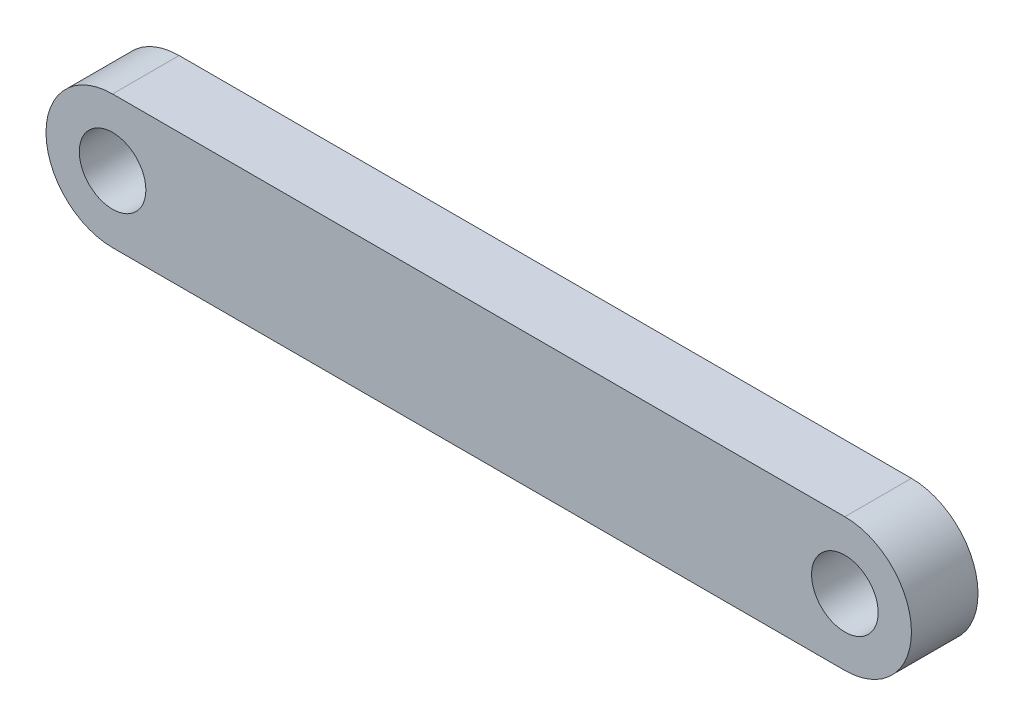
ISO-10303-21;
HEADER;
FILE_DESCRIPTION(('STEP AP214'),'2;1');
FILE_NAME('part.step','',(''),(''),'','','');
FILE_SCHEMA(('AUTOMOTIVE_DESIGN { 1 0 10303 214 1 1 1 1 }'));
ENDSEC;
DATA;
#1=APPLICATION_CONTEXT('core data for automotive mechanical design processes');
#2=APPLICATION_PROTOCOL_DEFINITION('international standard','automotive_design',2000,#1);
#3=PRODUCT_CONTEXT('',#1,'mechanical');
#4=PRODUCT('Part','Part','',(#3));
#5=PRODUCT_RELATED_PRODUCT_CATEGORY('part','',(#4));
#6=PRODUCT_DEFINITION_FORMATION('','',#4);
#7=PRODUCT_DEFINITION_CONTEXT('part definition',#1,'design');
#8=PRODUCT_DEFINITION('design','',#6,#7);
#9=PRODUCT_DEFINITION_SHAPE('','',#8);
#10=(LENGTH_UNIT() NAMED_UNIT(*) SI_UNIT(.MILLI.,.METRE.));
#11=(NAMED_UNIT(*) PLANE_ANGLE_UNIT() SI_UNIT($,.RADIAN.));
#12=(NAMED_UNIT(*) SI_UNIT($,.STERADIAN.) SOLID_ANGLE_UNIT());
#13=UNCERTAINTY_MEASURE_WITH_UNIT(LENGTH_MEASURE(1.E-05),#10,'distance_accuracy_value','');
#14=(GEOMETRIC_REPRESENTATION_CONTEXT(3) GLOBAL_UNCERTAINTY_ASSIGNED_CONTEXT((#13)) GLOBAL_UNIT_ASSIGNED_CONTEXT((#10,
#11,#12)) REPRESENTATION_CONTEXT('',''));
#15=CARTESIAN_POINT('',(0.,0.,0.));
#16=DIRECTION('',(0.,0.,1.));
#17=DIRECTION('',(1.,0.,0.));
#18=AXIS2_PLACEMENT_3D('',#15,#16,#17);
#19=CARTESIAN_POINT('',(0.,0.,10.));
#20=DIRECTION('',(0.,0.,-1.));
#21=DIRECTION('',(-1.,0.,0.));
#22=AXIS2_PLACEMENT_3D('',#19,#20,#21);
#23=CYLINDRICAL_SURFACE('',#22,10.);
#24=CARTESIAN_POINT('',(0.,0.,0.));
#25=DIRECTION('',(0.,0.,1.));
#26=DIRECTION('',(1.,0.,0.));
#27=AXIS2_PLACEMENT_3D('',#24,#25,#26);
#28=CIRCLE('',#27,10.);
#29=CARTESIAN_POINT('',(0.,10.,0.));
#30=VERTEX_POINT('',#29);
#31=CARTESIAN_POINT('',(0.,-10.,0.));
#32=VERTEX_POINT('',#31);
#33=EDGE_CURVE('E99',#30,#32,#28,.T.);
#34=ORIENTED_EDGE('',*,*,#33,.T.);
#35=DIRECTION('',(0.,0.,-1.));
#36=VECTOR('',#35,1.);
#37=CARTESIAN_POINT('',(0.,-10.,10.));
#38=LINE('',#37,#36);
#39=CARTESIAN_POINT('',(0.,-10.,10.));
#40=VERTEX_POINT('',#39);
#41=EDGE_CURVE('E11',#40,#32,#38,.T.);
#42=ORIENTED_EDGE('',*,*,#41,.F.);
#43=CARTESIAN_POINT('',(0.,0.,10.));
#44=DIRECTION('',(0.,0.,1.));
#45=DIRECTION('',(1.,0.,0.));
#46=AXIS2_PLACEMENT_3D('',#43,#44,#45);
#47=CIRCLE('',#46,10.);
#48=CARTESIAN_POINT('',(0.,10.,10.));
#49=VERTEX_POINT('',#48);
#50=EDGE_CURVE('E87',#49,#40,#47,.T.);
#51=ORIENTED_EDGE('',*,*,#50,.F.);
#52=DIRECTION('',(0.,0.,-1.));
#53=VECTOR('',#52,1.);
#54=CARTESIAN_POINT('',(0.,10.,10.));
#55=LINE('',#54,#53);
#56=EDGE_CURVE('E95',#49,#30,#55,.T.);
#57=ORIENTED_EDGE('',*,*,#56,.T.);
#58=EDGE_LOOP('',(#34,#42,#51,#57));
#59=FACE_BOUND('',#58,.T.);
#60=ADVANCED_FACE('F36',(#59),#23,.T.);
#61=CARTESIAN_POINT('',(0.,-10.,10.));
#62=DIRECTION('',(0.,1.,0.));
#63=DIRECTION('',(0.,0.,1.));
#64=AXIS2_PLACEMENT_3D('',#61,#62,#63);
#65=PLANE('',#64);
#66=DIRECTION('',(1.,0.,0.));
#67=VECTOR('',#66,1.);
#68=CARTESIAN_POINT('',(0.,-10.,0.));
#69=LINE('',#68,#67);
#70=CARTESIAN_POINT('',(110.,-10.,0.));
#71=VERTEX_POINT('',#70);
#72=EDGE_CURVE('E91',#32,#71,#69,.T.);
#73=ORIENTED_EDGE('',*,*,#72,.T.);
#74=DIRECTION('',(0.,0.,-1.));
#75=VECTOR('',#74,1.);
#76=CARTESIAN_POINT('',(110.,-10.,10.));
#77=LINE('',#76,#75);
#78=CARTESIAN_POINT('',(110.,-10.,10.));
#79=VERTEX_POINT('',#78);
#80=EDGE_CURVE('E44',#79,#71,#77,.T.);
#81=ORIENTED_EDGE('',*,*,#80,.F.);
#82=DIRECTION('',(1.,0.,0.));
#83=VECTOR('',#82,1.);
#84=CARTESIAN_POINT('',(0.,-10.,10.));
#85=LINE('',#84,#83);
#86=EDGE_CURVE('E82',#40,#79,#85,.T.);
#87=ORIENTED_EDGE('',*,*,#86,.F.);
#88=ORIENTED_EDGE('',*,*,#41,.T.);
#89=EDGE_LOOP('',(#73,#81,#87,#88));
#90=FACE_BOUND('',#89,.T.);
#91=ADVANCED_FACE('F90',(#90),#65,.F.);
#92=CARTESIAN_POINT('',(110.,0.,10.));
#93=DIRECTION('',(0.,0.,-1.));
#94=DIRECTION('',(-1.,0.,0.));
#95=AXIS2_PLACEMENT_3D('',#92,#93,#94);
#96=CYLINDRICAL_SURFACE('',#95,10.);
#97=CARTESIAN_POINT('',(110.,0.,0.));
#98=DIRECTION('',(0.,0.,1.));
#99=DIRECTION('',(-1.,0.,0.));
#100=AXIS2_PLACEMENT_3D('',#97,#98,#99);
#101=CIRCLE('',#100,10.);
#102=CARTESIAN_POINT('',(110.,10.,0.));
#103=VERTEX_POINT('',#102);
#104=EDGE_CURVE('E69',#71,#103,#101,.T.);
#105=ORIENTED_EDGE('',*,*,#104,.T.);
#106=DIRECTION('',(0.,0.,-1.));
#107=VECTOR('',#106,1.);
#108=CARTESIAN_POINT('',(110.,10.,10.));
#109=LINE('',#108,#107);
#110=CARTESIAN_POINT('',(110.,10.,10.));
#111=VERTEX_POINT('',#110);
#112=EDGE_CURVE('E92',#111,#103,#109,.T.);
#113=ORIENTED_EDGE('',*,*,#112,.F.);
#114=CARTESIAN_POINT('',(110.,0.,10.));
#115=DIRECTION('',(0.,0.,1.));
#116=DIRECTION('',(-1.,0.,0.));
#117=AXIS2_PLACEMENT_3D('',#114,#115,#116);
#118=CIRCLE('',#117,10.);
#119=EDGE_CURVE('E85',#79,#111,#118,.T.);
#120=ORIENTED_EDGE('',*,*,#119,.F.);
#121=ORIENTED_EDGE('',*,*,#80,.T.);
#122=EDGE_LOOP('',(#105,#113,#120,#121));
#123=FACE_BOUND('',#122,.T.);
#124=ADVANCED_FACE('F93',(#123),#96,.T.);
#125=CARTESIAN_POINT('',(0.,10.,10.));
#126=DIRECTION('',(0.,-1.,0.));
#127=DIRECTION('',(0.,0.,-1.));
#128=AXIS2_PLACEMENT_3D('',#125,#126,#127);
#129=PLANE('',#128);
#130=DIRECTION('',(-1.,0.,0.));
#131=VECTOR('',#130,1.);
#132=CARTESIAN_POINT('',(0.,10.,0.));
#133=LINE('',#132,#131);
#134=EDGE_CURVE('E75',#103,#30,#133,.T.);
#135=ORIENTED_EDGE('',*,*,#134,.T.);
#136=ORIENTED_EDGE('',*,*,#56,.F.);
#137=DIRECTION('',(-1.,0.,0.));
#138=VECTOR('',#137,1.);
#139=CARTESIAN_POINT('',(0.,10.,10.));
#140=LINE('',#139,#138);
#141=EDGE_CURVE('E52',#111,#49,#140,.T.);
#142=ORIENTED_EDGE('',*,*,#141,.F.);
#143=ORIENTED_EDGE('',*,*,#112,.T.);
#144=EDGE_LOOP('',(#135,#136,#142,#143));
#145=FACE_BOUND('',#144,.T.);
#146=ADVANCED_FACE('F107',(#145),#129,.F.);
#147=CARTESIAN_POINT('',(0.,0.,10.));
#148=DIRECTION('',(0.,0.,1.));
#149=DIRECTION('',(1.,0.,0.));
#150=AXIS2_PLACEMENT_3D('',#147,#148,#149);
#151=PLANE('',#150);
#152=CARTESIAN_POINT('',(110.,0.,10.));
#153=DIRECTION('',(0.,0.,1.));
#154=DIRECTION('',(1.,0.,0.));
#155=AXIS2_PLACEMENT_3D('',#152,#153,#154);
#156=CIRCLE('',#155,5.);
#157=CARTESIAN_POINT('',(115.,0.,10.));
#158=VERTEX_POINT('',#157);
#159=EDGE_CURVE('E119',#158,#158,#156,.T.);
#160=ORIENTED_EDGE('',*,*,#159,.F.);
#161=EDGE_LOOP('',(#160));
#162=FACE_BOUND('',#161,.T.);
#163=CARTESIAN_POINT('',(0.,0.,10.));
#164=DIRECTION('',(0.,0.,1.));
#165=DIRECTION('',(1.,0.,0.));
#166=AXIS2_PLACEMENT_3D('',#163,#164,#165);
#167=CIRCLE('',#166,5.);
#168=CARTESIAN_POINT('',(5.,0.,10.));
#169=VERTEX_POINT('',#168);
#170=EDGE_CURVE('E113',#169,#169,#167,.T.);
#171=ORIENTED_EDGE('',*,*,#170,.F.);
#172=EDGE_LOOP('',(#171));
#173=FACE_BOUND('',#172,.T.);
#174=ORIENTED_EDGE('',*,*,#50,.T.);
#175=ORIENTED_EDGE('',*,*,#86,.T.);
#176=ORIENTED_EDGE('',*,*,#119,.T.);
#177=ORIENTED_EDGE('',*,*,#141,.T.);
#178=EDGE_LOOP('',(#174,#175,#176,#177));
#179=FACE_BOUND('',#178,.T.);
#180=ADVANCED_FACE('F83',(#162,#173,#179),#151,.T.);
#181=CARTESIAN_POINT('',(0.,0.,0.));
#182=DIRECTION('',(0.,0.,1.));
#183=DIRECTION('',(1.,0.,0.));
#184=AXIS2_PLACEMENT_3D('',#181,#182,#183);
#185=PLANE('',#184);
#186=CARTESIAN_POINT('',(110.,0.,0.));
#187=DIRECTION('',(0.,0.,1.));
#188=DIRECTION('',(1.,0.,0.));
#189=AXIS2_PLACEMENT_3D('',#186,#187,#188);
#190=CIRCLE('',#189,5.);
#191=CARTESIAN_POINT('',(115.,0.,0.));
#192=VERTEX_POINT('',#191);
#193=EDGE_CURVE('E116',#192,#192,#190,.T.);
#194=ORIENTED_EDGE('',*,*,#193,.T.);
#195=EDGE_LOOP('',(#194));
#196=FACE_BOUND('',#195,.T.);
#197=CARTESIAN_POINT('',(0.,0.,0.));
#198=DIRECTION('',(0.,0.,1.));
#199=DIRECTION('',(1.,0.,0.));
#200=AXIS2_PLACEMENT_3D('',#197,#198,#199);
#201=CIRCLE('',#200,5.);
#202=CARTESIAN_POINT('',(5.,0.,0.));
#203=VERTEX_POINT('',#202);
#204=EDGE_CURVE('E102',#203,#203,#201,.T.);
#205=ORIENTED_EDGE('',*,*,#204,.T.);
#206=EDGE_LOOP('',(#205));
#207=FACE_BOUND('',#206,.T.);
#208=ORIENTED_EDGE('',*,*,#33,.F.);
#209=ORIENTED_EDGE('',*,*,#134,.F.);
#210=ORIENTED_EDGE('',*,*,#104,.F.);
#211=ORIENTED_EDGE('',*,*,#72,.F.);
#212=EDGE_LOOP('',(#208,#209,#210,#211));
#213=FACE_BOUND('',#212,.T.);
#214=ADVANCED_FACE('F110',(#196,#207,#213),#185,.F.);
#215=CARTESIAN_POINT('',(0.,0.,0.));
#216=DIRECTION('',(0.,0.,1.));
#217=DIRECTION('',(1.,0.,0.));
#218=AXIS2_PLACEMENT_3D('',#215,#216,#217);
#219=CYLINDRICAL_SURFACE('',#218,5.);
#220=ORIENTED_EDGE('',*,*,#204,.F.);
#221=EDGE_LOOP('',(#220));
#222=FACE_BOUND('',#221,.T.);
#223=ORIENTED_EDGE('',*,*,#170,.T.);
#224=EDGE_LOOP('',(#223));
#225=FACE_BOUND('',#224,.T.);
#226=ADVANCED_FACE('F130',(#222,#225),#219,.F.);
#227=CARTESIAN_POINT('',(110.,0.,0.));
#228=DIRECTION('',(0.,0.,1.));
#229=DIRECTION('',(1.,0.,0.));
#230=AXIS2_PLACEMENT_3D('',#227,#228,#229);
#231=CYLINDRICAL_SURFACE('',#230,5.);
#232=ORIENTED_EDGE('',*,*,#193,.F.);
#233=EDGE_LOOP('',(#232));
#234=FACE_BOUND('',#233,.T.);
#235=ORIENTED_EDGE('',*,*,#159,.T.);
#236=EDGE_LOOP('',(#235));
#237=FACE_BOUND('',#236,.T.);
#238=ADVANCED_FACE('F127',(#234,#237),#231,.F.);
#239=CLOSED_SHELL('',(#60,#91,#124,#146,#180,#214,#226,#238));
#240=MANIFOLD_SOLID_BREP('B2',#239);
#241=ADVANCED_BREP_SHAPE_REPRESENTATION('',(#18,#240),#14);
#242=SHAPE_DEFINITION_REPRESENTATION(#9,#241);
ENDSEC;
END-ISO-10303-21;
